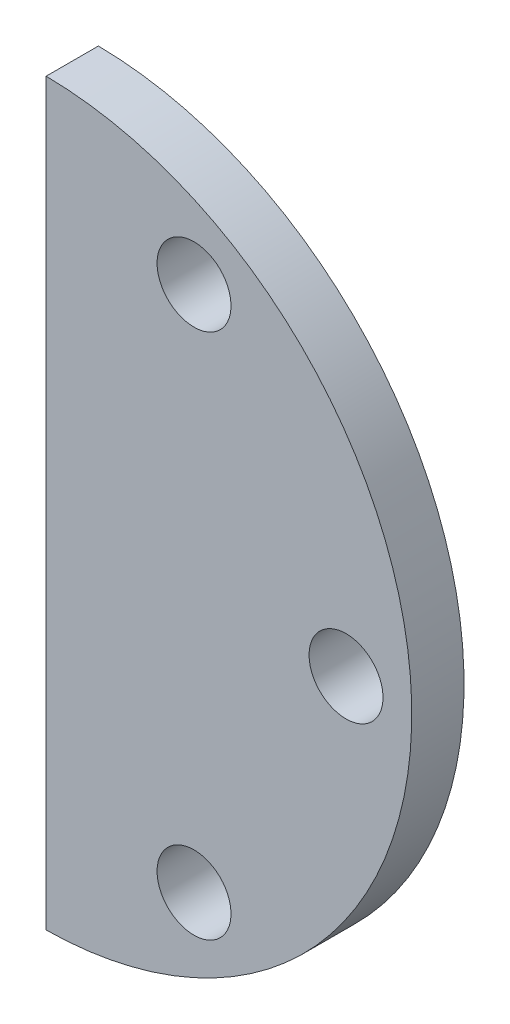
ISO-10303-21;
HEADER;
FILE_DESCRIPTION(('STEP AP214'),'2;1');
FILE_NAME('part.step','',(''),(''),'','','');
FILE_SCHEMA(('AUTOMOTIVE_DESIGN { 1 0 10303 214 1 1 1 1 }'));
ENDSEC;
DATA;
#1=APPLICATION_CONTEXT('core data for automotive mechanical design processes');
#2=APPLICATION_PROTOCOL_DEFINITION('international standard','automotive_design',2000,#1);
#3=PRODUCT_CONTEXT('',#1,'mechanical');
#4=PRODUCT('Part','Part','',(#3));
#5=PRODUCT_RELATED_PRODUCT_CATEGORY('part','',(#4));
#6=PRODUCT_DEFINITION_FORMATION('','',#4);
#7=PRODUCT_DEFINITION_CONTEXT('part definition',#1,'design');
#8=PRODUCT_DEFINITION('design','',#6,#7);
#9=PRODUCT_DEFINITION_SHAPE('','',#8);
#10=(LENGTH_UNIT() NAMED_UNIT(*) SI_UNIT(.MILLI.,.METRE.));
#11=(NAMED_UNIT(*) PLANE_ANGLE_UNIT() SI_UNIT($,.RADIAN.));
#12=(NAMED_UNIT(*) SI_UNIT($,.STERADIAN.) SOLID_ANGLE_UNIT());
#13=UNCERTAINTY_MEASURE_WITH_UNIT(LENGTH_MEASURE(1.E-05),#10,'distance_accuracy_value','');
#14=(GEOMETRIC_REPRESENTATION_CONTEXT(3) GLOBAL_UNCERTAINTY_ASSIGNED_CONTEXT((#13)) GLOBAL_UNIT_ASSIGNED_CONTEXT((#10,
#11,#12)) REPRESENTATION_CONTEXT('',''));
#15=CARTESIAN_POINT('',(0.,0.,0.));
#16=DIRECTION('',(0.,0.,1.));
#17=DIRECTION('',(1.,0.,0.));
#18=AXIS2_PLACEMENT_3D('',#15,#16,#17);
#19=CARTESIAN_POINT('',(0.,0.,3.18));
#20=DIRECTION('',(0.,0.,-1.));
#21=DIRECTION('',(-1.,0.,0.));
#22=AXIS2_PLACEMENT_3D('',#19,#20,#21);
#23=CYLINDRICAL_SURFACE('',#22,22.5);
#24=CARTESIAN_POINT('',(0.,0.,0.));
#25=DIRECTION('',(0.,0.,1.));
#26=DIRECTION('',(1.,0.,0.));
#27=AXIS2_PLACEMENT_3D('',#24,#25,#26);
#28=CIRCLE('',#27,22.5);
#29=CARTESIAN_POINT('',(0.250000000000006,-22.4986110682415,0.));
#30=VERTEX_POINT('',#29);
#31=CARTESIAN_POINT('',(0.250000000000008,22.4986110682415,0.));
#32=VERTEX_POINT('',#31);
#33=EDGE_CURVE('E77',#30,#32,#28,.T.);
#34=ORIENTED_EDGE('',*,*,#33,.T.);
#35=DIRECTION('',(0.,0.,-1.));
#36=VECTOR('',#35,1.);
#37=CARTESIAN_POINT('',(0.250000000000008,22.4986110682415,3.18));
#38=LINE('',#37,#36);
#39=CARTESIAN_POINT('',(0.250000000000008,22.4986110682415,3.18));
#40=VERTEX_POINT('',#39);
#41=EDGE_CURVE('E11',#40,#32,#38,.T.);
#42=ORIENTED_EDGE('',*,*,#41,.F.);
#43=CARTESIAN_POINT('',(0.,0.,3.18));
#44=DIRECTION('',(0.,0.,1.));
#45=DIRECTION('',(1.,0.,0.));
#46=AXIS2_PLACEMENT_3D('',#43,#44,#45);
#47=CIRCLE('',#46,22.5);
#48=CARTESIAN_POINT('',(0.250000000000006,-22.4986110682415,3.18));
#49=VERTEX_POINT('',#48);
#50=EDGE_CURVE('E80',#49,#40,#47,.T.);
#51=ORIENTED_EDGE('',*,*,#50,.F.);
#52=DIRECTION('',(0.,0.,-1.));
#53=VECTOR('',#52,1.);
#54=CARTESIAN_POINT('',(0.250000000000006,-22.4986110682415,3.18));
#55=LINE('',#54,#53);
#56=EDGE_CURVE('E53',#49,#30,#55,.T.);
#57=ORIENTED_EDGE('',*,*,#56,.T.);
#58=EDGE_LOOP('',(#34,#42,#51,#57));
#59=FACE_BOUND('',#58,.T.);
#60=ADVANCED_FACE('F43',(#59),#23,.T.);
#61=CARTESIAN_POINT('',(9.25000000000191,-16.0214699700121,3.18));
#62=DIRECTION('',(0.,0.,-1.));
#63=DIRECTION('',(-1.,0.,0.));
#64=AXIS2_PLACEMENT_3D('',#61,#62,#63);
#65=CYLINDRICAL_SURFACE('',#64,2.25000000000046);
#66=CARTESIAN_POINT('',(9.25000000000191,-16.0214699700121,3.18));
#67=DIRECTION('',(0.,0.,1.));
#68=DIRECTION('',(1.,0.,0.));
#69=AXIS2_PLACEMENT_3D('',#66,#67,#68);
#70=CIRCLE('',#69,2.25000000000046);
#71=CARTESIAN_POINT('',(7.00000000000144,-16.0214699700121,3.18));
#72=VERTEX_POINT('',#71);
#73=EDGE_CURVE('E102',#72,#72,#70,.T.);
#74=CARTESIAN_POINT('',(9.25000000000191,-16.0214699700121,0.));
#75=DIRECTION('',(0.,0.,1.));
#76=DIRECTION('',(1.,0.,0.));
#77=AXIS2_PLACEMENT_3D('',#74,#75,#76);
#78=CIRCLE('',#77,2.25000000000046);
#79=CARTESIAN_POINT('',(7.00000000000144,-16.0214699700121,0.));
#80=VERTEX_POINT('',#79);
#81=EDGE_CURVE('E84',#80,#80,#78,.T.);
#82=CARTESIAN_POINT('',(7.00000000000144,-16.0214699700121,3.18));
#83=CARTESIAN_POINT('',(7.00000000000144,-16.0214699700121,3.146875));
#84=CARTESIAN_POINT('',(7.00000000000144,-16.0214699700121,3.11375));
#85=CARTESIAN_POINT('',(7.00000000000144,-16.0214699700121,3.0475));
#86=CARTESIAN_POINT('',(7.00000000000144,-16.0214699700121,3.014375));
#87=CARTESIAN_POINT('',(7.00000000000144,-16.0214699700121,2.948125));
#88=CARTESIAN_POINT('',(7.00000000000144,-16.0214699700121,2.915));
#89=CARTESIAN_POINT('',(7.00000000000144,-16.0214699700121,2.84875));
#90=CARTESIAN_POINT('',(7.00000000000144,-16.0214699700121,2.815625));
#91=CARTESIAN_POINT('',(7.00000000000144,-16.0214699700121,2.749375));
#92=CARTESIAN_POINT('',(7.00000000000144,-16.0214699700121,2.71625));
#93=CARTESIAN_POINT('',(7.00000000000144,-16.0214699700121,2.65));
#94=CARTESIAN_POINT('',(7.00000000000144,-16.0214699700121,2.616875));
#95=CARTESIAN_POINT('',(7.00000000000144,-16.0214699700121,2.550625));
#96=CARTESIAN_POINT('',(7.00000000000144,-16.0214699700121,2.5175));
#97=CARTESIAN_POINT('',(7.00000000000144,-16.0214699700121,2.45125));
#98=CARTESIAN_POINT('',(7.00000000000144,-16.0214699700121,2.418125));
#99=CARTESIAN_POINT('',(7.00000000000144,-16.0214699700121,2.351875));
#100=CARTESIAN_POINT('',(7.00000000000144,-16.0214699700121,2.31875));
#101=CARTESIAN_POINT('',(7.00000000000144,-16.0214699700121,2.2525));
#102=CARTESIAN_POINT('',(7.00000000000144,-16.0214699700121,2.219375));
#103=CARTESIAN_POINT('',(7.00000000000144,-16.0214699700121,2.153125));
#104=CARTESIAN_POINT('',(7.00000000000144,-16.0214699700121,2.12));
#105=CARTESIAN_POINT('',(7.00000000000144,-16.0214699700121,2.05375));
#106=CARTESIAN_POINT('',(7.00000000000144,-16.0214699700121,2.020625));
#107=CARTESIAN_POINT('',(7.00000000000144,-16.0214699700121,1.954375));
#108=CARTESIAN_POINT('',(7.00000000000144,-16.0214699700121,1.92125));
#109=CARTESIAN_POINT('',(7.00000000000144,-16.0214699700121,1.855));
#110=CARTESIAN_POINT('',(7.00000000000144,-16.0214699700121,1.821875));
#111=CARTESIAN_POINT('',(7.00000000000144,-16.0214699700121,1.755625));
#112=CARTESIAN_POINT('',(7.00000000000144,-16.0214699700121,1.7225));
#113=CARTESIAN_POINT('',(7.00000000000144,-16.0214699700121,1.65625));
#114=CARTESIAN_POINT('',(7.00000000000144,-16.0214699700121,1.623125));
#115=CARTESIAN_POINT('',(7.00000000000144,-16.0214699700121,1.556875));
#116=CARTESIAN_POINT('',(7.00000000000144,-16.0214699700121,1.52375));
#117=CARTESIAN_POINT('',(7.00000000000144,-16.0214699700121,1.4575));
#118=CARTESIAN_POINT('',(7.00000000000144,-16.0214699700121,1.424375));
#119=CARTESIAN_POINT('',(7.00000000000144,-16.0214699700121,1.358125));
#120=CARTESIAN_POINT('',(7.00000000000144,-16.0214699700121,1.325));
#121=CARTESIAN_POINT('',(7.00000000000144,-16.0214699700121,1.25875));
#122=CARTESIAN_POINT('',(7.00000000000144,-16.0214699700121,1.225625));
#123=CARTESIAN_POINT('',(7.00000000000144,-16.0214699700121,1.159375));
#124=CARTESIAN_POINT('',(7.00000000000144,-16.0214699700121,1.12625));
#125=CARTESIAN_POINT('',(7.00000000000144,-16.0214699700121,1.06));
#126=CARTESIAN_POINT('',(7.00000000000144,-16.0214699700121,1.026875));
#127=CARTESIAN_POINT('',(7.00000000000144,-16.0214699700121,0.960625));
#128=CARTESIAN_POINT('',(7.00000000000144,-16.0214699700121,0.9275));
#129=CARTESIAN_POINT('',(7.00000000000144,-16.0214699700121,0.86125));
#130=CARTESIAN_POINT('',(7.00000000000144,-16.0214699700121,0.828125));
#131=CARTESIAN_POINT('',(7.00000000000144,-16.0214699700121,0.761875));
#132=CARTESIAN_POINT('',(7.00000000000144,-16.0214699700121,0.72875));
#133=CARTESIAN_POINT('',(7.00000000000144,-16.0214699700121,0.6625));
#134=CARTESIAN_POINT('',(7.00000000000144,-16.0214699700121,0.629375));
#135=CARTESIAN_POINT('',(7.00000000000144,-16.0214699700121,0.563125));
#136=CARTESIAN_POINT('',(7.00000000000144,-16.0214699700121,0.53));
#137=CARTESIAN_POINT('',(7.00000000000144,-16.0214699700121,0.46375));
#138=CARTESIAN_POINT('',(7.00000000000144,-16.0214699700121,0.430625));
#139=CARTESIAN_POINT('',(7.00000000000144,-16.0214699700121,0.364375));
#140=CARTESIAN_POINT('',(7.00000000000144,-16.0214699700121,0.33125));
#141=CARTESIAN_POINT('',(7.00000000000144,-16.0214699700121,0.265));
#142=CARTESIAN_POINT('',(7.00000000000144,-16.0214699700121,0.231875));
#143=CARTESIAN_POINT('',(7.00000000000144,-16.0214699700121,0.165625));
#144=CARTESIAN_POINT('',(7.00000000000144,-16.0214699700121,0.1325));
#145=CARTESIAN_POINT('',(7.00000000000144,-16.0214699700121,0.06625));
#146=CARTESIAN_POINT('',(7.00000000000144,-16.0214699700121,0.033125));
#147=CARTESIAN_POINT('',(7.00000000000144,-16.0214699700121,0.));
#148=B_SPLINE_CURVE_WITH_KNOTS('',3,(#82,#83,#84,#85,#86,#87,#88,#89,#90,#91,#92,#93,#94,#95,
#96,#97,#98,#99,#100,#101,#102,#103,#104,#105,#106,#107,#108,#109,#110,#111,#112,#113,#114,#115,
#116,#117,#118,#119,#120,#121,#122,#123,#124,#125,#126,#127,#128,#129,#130,#131,#132,#133,#134,
#135,#136,#137,#138,#139,#140,#141,#142,#143,#144,#145,#146,#147),.UNSPECIFIED.,.F.,.F.,(4,2,2,
2,2,2,2,2,2,2,2,2,2,2,2,2,2,2,2,2,2,2,2,2,2,2,2,2,2,2,2,2,4),(0.,0.0993750000000001,0.19875,
0.298125,0.3975,0.496875,0.59625,0.695625,0.795,0.894375,0.99375,1.093125,1.1925,1.291875,
1.39125,1.490625,1.59,1.689375,1.78875,1.888125,1.9875,2.086875,2.18625,2.285625,2.385,2.484375,
2.58375,2.683125,2.7825,2.881875,2.98125,3.080625,3.18),.UNSPECIFIED.);
#149=EDGE_CURVE('BSEAM124',#72,#80,#148,.T.);
#150=ORIENTED_EDGE('',*,*,#73,.T.);
#151=ORIENTED_EDGE('',*,*,#81,.F.);
#152=ORIENTED_EDGE('',*,*,#149,.T.);
#153=ORIENTED_EDGE('',*,*,#149,.F.);
#154=EDGE_LOOP('',(#150,#152,#151,#153));
#155=FACE_BOUND('',#154,.T.);
#156=ADVANCED_FACE('F124',(#155),#65,.F.);
#157=CARTESIAN_POINT('',(18.5000000000009,6.39585606698739E-13,3.18));
#158=DIRECTION('',(0.,0.,-1.));
#159=DIRECTION('',(-1.,0.,0.));
#160=AXIS2_PLACEMENT_3D('',#157,#158,#159);
#161=CYLINDRICAL_SURFACE('',#160,2.24999999999973);
#162=CARTESIAN_POINT('',(18.5000000000009,6.39585606698739E-13,3.18));
#163=DIRECTION('',(0.,0.,1.));
#164=DIRECTION('',(1.,0.,0.));
#165=AXIS2_PLACEMENT_3D('',#162,#163,#164);
#166=CIRCLE('',#165,2.24999999999973);
#167=CARTESIAN_POINT('',(16.2500000000012,6.39585606698739E-13,3.18));
#168=VERTEX_POINT('',#167);
#169=EDGE_CURVE('E106',#168,#168,#166,.T.);
#170=CARTESIAN_POINT('',(18.5000000000009,6.39585606698739E-13,0.));
#171=DIRECTION('',(0.,0.,1.));
#172=DIRECTION('',(1.,0.,0.));
#173=AXIS2_PLACEMENT_3D('',#170,#171,#172);
#174=CIRCLE('',#173,2.24999999999973);
#175=CARTESIAN_POINT('',(16.2500000000012,6.39585606698739E-13,0.));
#176=VERTEX_POINT('',#175);
#177=EDGE_CURVE('E88',#176,#176,#174,.T.);
#178=CARTESIAN_POINT('',(16.2500000000012,6.39585606698739E-13,3.18));
#179=CARTESIAN_POINT('',(16.2500000000012,6.39585606698739E-13,3.146875));
#180=CARTESIAN_POINT('',(16.2500000000012,6.39585606698739E-13,3.11375));
#181=CARTESIAN_POINT('',(16.2500000000012,6.39585606698739E-13,3.0475));
#182=CARTESIAN_POINT('',(16.2500000000012,6.39585606698739E-13,3.014375));
#183=CARTESIAN_POINT('',(16.2500000000012,6.39585606698739E-13,2.948125));
#184=CARTESIAN_POINT('',(16.2500000000012,6.39585606698739E-13,2.915));
#185=CARTESIAN_POINT('',(16.2500000000012,6.39585606698739E-13,2.84875));
#186=CARTESIAN_POINT('',(16.2500000000012,6.39585606698739E-13,2.815625));
#187=CARTESIAN_POINT('',(16.2500000000012,6.39585606698739E-13,2.749375));
#188=CARTESIAN_POINT('',(16.2500000000012,6.39585606698739E-13,2.71625));
#189=CARTESIAN_POINT('',(16.2500000000012,6.39585606698739E-13,2.65));
#190=CARTESIAN_POINT('',(16.2500000000012,6.39585606698739E-13,2.616875));
#191=CARTESIAN_POINT('',(16.2500000000012,6.39585606698739E-13,2.550625));
#192=CARTESIAN_POINT('',(16.2500000000012,6.39585606698739E-13,2.5175));
#193=CARTESIAN_POINT('',(16.2500000000012,6.39585606698739E-13,2.45125));
#194=CARTESIAN_POINT('',(16.2500000000012,6.39585606698739E-13,2.418125));
#195=CARTESIAN_POINT('',(16.2500000000012,6.39585606698739E-13,2.351875));
#196=CARTESIAN_POINT('',(16.2500000000012,6.39585606698739E-13,2.31875));
#197=CARTESIAN_POINT('',(16.2500000000012,6.39585606698739E-13,2.2525));
#198=CARTESIAN_POINT('',(16.2500000000012,6.39585606698739E-13,2.219375));
#199=CARTESIAN_POINT('',(16.2500000000012,6.39585606698739E-13,2.153125));
#200=CARTESIAN_POINT('',(16.2500000000012,6.39585606698739E-13,2.12));
#201=CARTESIAN_POINT('',(16.2500000000012,6.39585606698739E-13,2.05375));
#202=CARTESIAN_POINT('',(16.2500000000012,6.39585606698739E-13,2.020625));
#203=CARTESIAN_POINT('',(16.2500000000012,6.39585606698739E-13,1.954375));
#204=CARTESIAN_POINT('',(16.2500000000012,6.39585606698739E-13,1.92125));
#205=CARTESIAN_POINT('',(16.2500000000012,6.39585606698739E-13,1.855));
#206=CARTESIAN_POINT('',(16.2500000000012,6.39585606698739E-13,1.821875));
#207=CARTESIAN_POINT('',(16.2500000000012,6.39585606698739E-13,1.755625));
#208=CARTESIAN_POINT('',(16.2500000000012,6.39585606698739E-13,1.7225));
#209=CARTESIAN_POINT('',(16.2500000000012,6.39585606698739E-13,1.65625));
#210=CARTESIAN_POINT('',(16.2500000000012,6.39585606698739E-13,1.623125));
#211=CARTESIAN_POINT('',(16.2500000000012,6.39585606698739E-13,1.556875));
#212=CARTESIAN_POINT('',(16.2500000000012,6.39585606698739E-13,1.52375));
#213=CARTESIAN_POINT('',(16.2500000000012,6.39585606698739E-13,1.4575));
#214=CARTESIAN_POINT('',(16.2500000000012,6.39585606698739E-13,1.424375));
#215=CARTESIAN_POINT('',(16.2500000000012,6.39585606698739E-13,1.358125));
#216=CARTESIAN_POINT('',(16.2500000000012,6.39585606698739E-13,1.325));
#217=CARTESIAN_POINT('',(16.2500000000012,6.39585606698739E-13,1.25875));
#218=CARTESIAN_POINT('',(16.2500000000012,6.39585606698739E-13,1.225625));
#219=CARTESIAN_POINT('',(16.2500000000012,6.39585606698739E-13,1.159375));
#220=CARTESIAN_POINT('',(16.2500000000012,6.39585606698739E-13,1.12625));
#221=CARTESIAN_POINT('',(16.2500000000012,6.39585606698739E-13,1.06));
#222=CARTESIAN_POINT('',(16.2500000000012,6.39585606698739E-13,1.026875));
#223=CARTESIAN_POINT('',(16.2500000000012,6.39585606698739E-13,0.960625));
#224=CARTESIAN_POINT('',(16.2500000000012,6.39585606698739E-13,0.9275));
#225=CARTESIAN_POINT('',(16.2500000000012,6.39585606698739E-13,0.86125));
#226=CARTESIAN_POINT('',(16.2500000000012,6.39585606698739E-13,0.828125));
#227=CARTESIAN_POINT('',(16.2500000000012,6.39585606698739E-13,0.761875));
#228=CARTESIAN_POINT('',(16.2500000000012,6.39585606698739E-13,0.72875));
#229=CARTESIAN_POINT('',(16.2500000000012,6.39585606698739E-13,0.6625));
#230=CARTESIAN_POINT('',(16.2500000000012,6.39585606698739E-13,0.629375));
#231=CARTESIAN_POINT('',(16.2500000000012,6.39585606698739E-13,0.563125));
#232=CARTESIAN_POINT('',(16.2500000000012,6.39585606698739E-13,0.53));
#233=CARTESIAN_POINT('',(16.2500000000012,6.39585606698739E-13,0.46375));
#234=CARTESIAN_POINT('',(16.2500000000012,6.39585606698739E-13,0.430625));
#235=CARTESIAN_POINT('',(16.2500000000012,6.39585606698739E-13,0.364375));
#236=CARTESIAN_POINT('',(16.2500000000012,6.39585606698739E-13,0.33125));
#237=CARTESIAN_POINT('',(16.2500000000012,6.39585606698739E-13,0.265));
#238=CARTESIAN_POINT('',(16.2500000000012,6.39585606698739E-13,0.231875));
#239=CARTESIAN_POINT('',(16.2500000000012,6.39585606698739E-13,0.165625));
#240=CARTESIAN_POINT('',(16.2500000000012,6.39585606698739E-13,0.1325));
#241=CARTESIAN_POINT('',(16.2500000000012,6.39585606698739E-13,0.06625));
#242=CARTESIAN_POINT('',(16.2500000000012,6.39585606698739E-13,0.033125));
#243=CARTESIAN_POINT('',(16.2500000000012,6.39585606698739E-13,0.));
#244=B_SPLINE_CURVE_WITH_KNOTS('',3,(#178,#179,#180,#181,#182,#183,#184,#185,#186,#187,#188,
#189,#190,#191,#192,#193,#194,#195,#196,#197,#198,#199,#200,#201,#202,#203,#204,#205,#206,#207,
#208,#209,#210,#211,#212,#213,#214,#215,#216,#217,#218,#219,#220,#221,#222,#223,#224,#225,#226,
#227,#228,#229,#230,#231,#232,#233,#234,#235,#236,#237,#238,#239,#240,#241,#242,#243),
.UNSPECIFIED.,.F.,.F.,(4,2,2,2,2,2,2,2,2,2,2,2,2,2,2,2,2,2,2,2,2,2,2,2,2,2,2,2,2,2,2,2,4),(0.,
0.0993750000000001,0.19875,0.298125,0.3975,0.496875,0.59625,0.695625,0.795,0.894375,0.99375,
1.093125,1.1925,1.291875,1.39125,1.490625,1.59,1.689375,1.78875,1.888125,1.9875,2.086875,
2.18625,2.285625,2.385,2.484375,2.58375,2.683125,2.7825,2.881875,2.98125,3.080625,3.18),.UNSPECIFIED.);
#245=EDGE_CURVE('BSEAM127',#168,#176,#244,.T.);
#246=ORIENTED_EDGE('',*,*,#169,.T.);
#247=ORIENTED_EDGE('',*,*,#177,.F.);
#248=ORIENTED_EDGE('',*,*,#245,.T.);
#249=ORIENTED_EDGE('',*,*,#245,.F.);
#250=EDGE_LOOP('',(#246,#248,#247,#249));
#251=FACE_BOUND('',#250,.T.);
#252=ADVANCED_FACE('F127',(#251),#161,.F.);
#253=CARTESIAN_POINT('',(9.2499999999999,16.0214699700122,3.18));
#254=DIRECTION('',(0.,0.,-1.));
#255=DIRECTION('',(-1.,0.,0.));
#256=AXIS2_PLACEMENT_3D('',#253,#254,#255);
#257=CYLINDRICAL_SURFACE('',#256,2.25);
#258=CARTESIAN_POINT('',(9.2499999999999,16.0214699700122,3.18));
#259=DIRECTION('',(0.,0.,1.));
#260=DIRECTION('',(1.,0.,0.));
#261=AXIS2_PLACEMENT_3D('',#258,#259,#260);
#262=CIRCLE('',#261,2.25);
#263=CARTESIAN_POINT('',(6.9999999999999,16.0214699700122,3.18));
#264=VERTEX_POINT('',#263);
#265=EDGE_CURVE('E76',#264,#264,#262,.T.);
#266=CARTESIAN_POINT('',(9.2499999999999,16.0214699700122,0.));
#267=DIRECTION('',(0.,0.,1.));
#268=DIRECTION('',(1.,0.,0.));
#269=AXIS2_PLACEMENT_3D('',#266,#267,#268);
#270=CIRCLE('',#269,2.25);
#271=CARTESIAN_POINT('',(6.9999999999999,16.0214699700122,0.));
#272=VERTEX_POINT('',#271);
#273=EDGE_CURVE('E94',#272,#272,#270,.T.);
#274=CARTESIAN_POINT('',(6.9999999999999,16.0214699700122,3.18));
#275=CARTESIAN_POINT('',(6.9999999999999,16.0214699700122,3.146875));
#276=CARTESIAN_POINT('',(6.9999999999999,16.0214699700122,3.11375));
#277=CARTESIAN_POINT('',(6.9999999999999,16.0214699700122,3.0475));
#278=CARTESIAN_POINT('',(6.9999999999999,16.0214699700122,3.014375));
#279=CARTESIAN_POINT('',(6.9999999999999,16.0214699700122,2.948125));
#280=CARTESIAN_POINT('',(6.9999999999999,16.0214699700122,2.915));
#281=CARTESIAN_POINT('',(6.9999999999999,16.0214699700122,2.84875));
#282=CARTESIAN_POINT('',(6.9999999999999,16.0214699700122,2.815625));
#283=CARTESIAN_POINT('',(6.9999999999999,16.0214699700122,2.749375));
#284=CARTESIAN_POINT('',(6.9999999999999,16.0214699700122,2.71625));
#285=CARTESIAN_POINT('',(6.9999999999999,16.0214699700122,2.65));
#286=CARTESIAN_POINT('',(6.9999999999999,16.0214699700122,2.616875));
#287=CARTESIAN_POINT('',(6.9999999999999,16.0214699700122,2.550625));
#288=CARTESIAN_POINT('',(6.9999999999999,16.0214699700122,2.5175));
#289=CARTESIAN_POINT('',(6.9999999999999,16.0214699700122,2.45125));
#290=CARTESIAN_POINT('',(6.9999999999999,16.0214699700122,2.418125));
#291=CARTESIAN_POINT('',(6.9999999999999,16.0214699700122,2.351875));
#292=CARTESIAN_POINT('',(6.9999999999999,16.0214699700122,2.31875));
#293=CARTESIAN_POINT('',(6.9999999999999,16.0214699700122,2.2525));
#294=CARTESIAN_POINT('',(6.9999999999999,16.0214699700122,2.219375));
#295=CARTESIAN_POINT('',(6.9999999999999,16.0214699700122,2.153125));
#296=CARTESIAN_POINT('',(6.9999999999999,16.0214699700122,2.12));
#297=CARTESIAN_POINT('',(6.9999999999999,16.0214699700122,2.05375));
#298=CARTESIAN_POINT('',(6.9999999999999,16.0214699700122,2.020625));
#299=CARTESIAN_POINT('',(6.9999999999999,16.0214699700122,1.954375));
#300=CARTESIAN_POINT('',(6.9999999999999,16.0214699700122,1.92125));
#301=CARTESIAN_POINT('',(6.9999999999999,16.0214699700122,1.855));
#302=CARTESIAN_POINT('',(6.9999999999999,16.0214699700122,1.821875));
#303=CARTESIAN_POINT('',(6.9999999999999,16.0214699700122,1.755625));
#304=CARTESIAN_POINT('',(6.9999999999999,16.0214699700122,1.7225));
#305=CARTESIAN_POINT('',(6.9999999999999,16.0214699700122,1.65625));
#306=CARTESIAN_POINT('',(6.9999999999999,16.0214699700122,1.623125));
#307=CARTESIAN_POINT('',(6.9999999999999,16.0214699700122,1.556875));
#308=CARTESIAN_POINT('',(6.9999999999999,16.0214699700122,1.52375));
#309=CARTESIAN_POINT('',(6.9999999999999,16.0214699700122,1.4575));
#310=CARTESIAN_POINT('',(6.9999999999999,16.0214699700122,1.424375));
#311=CARTESIAN_POINT('',(6.9999999999999,16.0214699700122,1.358125));
#312=CARTESIAN_POINT('',(6.9999999999999,16.0214699700122,1.325));
#313=CARTESIAN_POINT('',(6.9999999999999,16.0214699700122,1.25875));
#314=CARTESIAN_POINT('',(6.9999999999999,16.0214699700122,1.225625));
#315=CARTESIAN_POINT('',(6.9999999999999,16.0214699700122,1.159375));
#316=CARTESIAN_POINT('',(6.9999999999999,16.0214699700122,1.12625));
#317=CARTESIAN_POINT('',(6.9999999999999,16.0214699700122,1.06));
#318=CARTESIAN_POINT('',(6.9999999999999,16.0214699700122,1.026875));
#319=CARTESIAN_POINT('',(6.9999999999999,16.0214699700122,0.960625));
#320=CARTESIAN_POINT('',(6.9999999999999,16.0214699700122,0.9275));
#321=CARTESIAN_POINT('',(6.9999999999999,16.0214699700122,0.86125));
#322=CARTESIAN_POINT('',(6.9999999999999,16.0214699700122,0.828125));
#323=CARTESIAN_POINT('',(6.9999999999999,16.0214699700122,0.761875));
#324=CARTESIAN_POINT('',(6.9999999999999,16.0214699700122,0.72875));
#325=CARTESIAN_POINT('',(6.9999999999999,16.0214699700122,0.6625));
#326=CARTESIAN_POINT('',(6.9999999999999,16.0214699700122,0.629375));
#327=CARTESIAN_POINT('',(6.9999999999999,16.0214699700122,0.563125));
#328=CARTESIAN_POINT('',(6.9999999999999,16.0214699700122,0.53));
#329=CARTESIAN_POINT('',(6.9999999999999,16.0214699700122,0.46375));
#330=CARTESIAN_POINT('',(6.9999999999999,16.0214699700122,0.430625));
#331=CARTESIAN_POINT('',(6.9999999999999,16.0214699700122,0.364375));
#332=CARTESIAN_POINT('',(6.9999999999999,16.0214699700122,0.33125));
#333=CARTESIAN_POINT('',(6.9999999999999,16.0214699700122,0.265));
#334=CARTESIAN_POINT('',(6.9999999999999,16.0214699700122,0.231875));
#335=CARTESIAN_POINT('',(6.9999999999999,16.0214699700122,0.165625));
#336=CARTESIAN_POINT('',(6.9999999999999,16.0214699700122,0.1325));
#337=CARTESIAN_POINT('',(6.9999999999999,16.0214699700122,0.06625));
#338=CARTESIAN_POINT('',(6.9999999999999,16.0214699700122,0.033125));
#339=CARTESIAN_POINT('',(6.9999999999999,16.0214699700122,0.));
#340=B_SPLINE_CURVE_WITH_KNOTS('',3,(#274,#275,#276,#277,#278,#279,#280,#281,#282,#283,#284,
#285,#286,#287,#288,#289,#290,#291,#292,#293,#294,#295,#296,#297,#298,#299,#300,#301,#302,#303,
#304,#305,#306,#307,#308,#309,#310,#311,#312,#313,#314,#315,#316,#317,#318,#319,#320,#321,#322,
#323,#324,#325,#326,#327,#328,#329,#330,#331,#332,#333,#334,#335,#336,#337,#338,#339),
.UNSPECIFIED.,.F.,.F.,(4,2,2,2,2,2,2,2,2,2,2,2,2,2,2,2,2,2,2,2,2,2,2,2,2,2,2,2,2,2,2,2,4),(0.,
0.0993750000000001,0.19875,0.298125,0.3975,0.496875,0.59625,0.695625,0.795,0.894375,0.99375,
1.093125,1.1925,1.291875,1.39125,1.490625,1.59,1.689375,1.78875,1.888125,1.9875,2.086875,
2.18625,2.285625,2.385,2.484375,2.58375,2.683125,2.7825,2.881875,2.98125,3.080625,3.18),.UNSPECIFIED.);
#341=EDGE_CURVE('BSEAM45',#264,#272,#340,.T.);
#342=ORIENTED_EDGE('',*,*,#265,.T.);
#343=ORIENTED_EDGE('',*,*,#273,.F.);
#344=ORIENTED_EDGE('',*,*,#341,.T.);
#345=ORIENTED_EDGE('',*,*,#341,.F.);
#346=EDGE_LOOP('',(#342,#344,#343,#345));
#347=FACE_BOUND('',#346,.T.);
#348=ADVANCED_FACE('F45',(#347),#257,.F.);
#349=CARTESIAN_POINT('',(0.250000000000007,0.,3.18));
#350=DIRECTION('',(1.,0.,0.));
#351=DIRECTION('',(0.,1.,0.));
#352=AXIS2_PLACEMENT_3D('',#349,#350,#351);
#353=PLANE('',#352);
#354=DIRECTION('',(0.,-1.,0.));
#355=VECTOR('',#354,1.);
#356=CARTESIAN_POINT('',(0.250000000000007,0.,0.));
#357=LINE('',#356,#355);
#358=EDGE_CURVE('E68',#32,#30,#357,.T.);
#359=ORIENTED_EDGE('',*,*,#358,.T.);
#360=ORIENTED_EDGE('',*,*,#56,.F.);
#361=DIRECTION('',(0.,-1.,0.));
#362=VECTOR('',#361,1.);
#363=CARTESIAN_POINT('',(0.250000000000007,0.,3.18));
#364=LINE('',#363,#362);
#365=EDGE_CURVE('E60',#40,#49,#364,.T.);
#366=ORIENTED_EDGE('',*,*,#365,.F.);
#367=ORIENTED_EDGE('',*,*,#41,.T.);
#368=EDGE_LOOP('',(#359,#360,#366,#367));
#369=FACE_BOUND('',#368,.T.);
#370=ADVANCED_FACE('F71',(#369),#353,.F.);
#371=CARTESIAN_POINT('',(0.,0.,3.18));
#372=DIRECTION('',(0.,0.,1.));
#373=DIRECTION('',(1.,0.,0.));
#374=AXIS2_PLACEMENT_3D('',#371,#372,#373);
#375=PLANE('',#374);
#376=ORIENTED_EDGE('',*,*,#265,.F.);
#377=EDGE_LOOP('',(#376));
#378=FACE_BOUND('',#377,.T.);
#379=ORIENTED_EDGE('',*,*,#169,.F.);
#380=EDGE_LOOP('',(#379));
#381=FACE_BOUND('',#380,.T.);
#382=ORIENTED_EDGE('',*,*,#73,.F.);
#383=EDGE_LOOP('',(#382));
#384=FACE_BOUND('',#383,.T.);
#385=ORIENTED_EDGE('',*,*,#50,.T.);
#386=ORIENTED_EDGE('',*,*,#365,.T.);
#387=EDGE_LOOP('',(#385,#386));
#388=FACE_BOUND('',#387,.T.);
#389=ADVANCED_FACE('F116',(#378,#381,#384,#388),#375,.T.);
#390=CARTESIAN_POINT('',(0.,0.,0.));
#391=DIRECTION('',(0.,0.,1.));
#392=DIRECTION('',(1.,0.,0.));
#393=AXIS2_PLACEMENT_3D('',#390,#391,#392);
#394=PLANE('',#393);
#395=ORIENTED_EDGE('',*,*,#273,.T.);
#396=EDGE_LOOP('',(#395));
#397=FACE_BOUND('',#396,.T.);
#398=ORIENTED_EDGE('',*,*,#177,.T.);
#399=EDGE_LOOP('',(#398));
#400=FACE_BOUND('',#399,.T.);
#401=ORIENTED_EDGE('',*,*,#81,.T.);
#402=EDGE_LOOP('',(#401));
#403=FACE_BOUND('',#402,.T.);
#404=ORIENTED_EDGE('',*,*,#33,.F.);
#405=ORIENTED_EDGE('',*,*,#358,.F.);
#406=EDGE_LOOP('',(#404,#405));
#407=FACE_BOUND('',#406,.T.);
#408=ADVANCED_FACE('F82',(#397,#400,#403,#407),#394,.F.);
#409=CLOSED_SHELL('',(#60,#156,#252,#348,#370,#389,#408));
#410=MANIFOLD_SOLID_BREP('B2',#409);
#411=ADVANCED_BREP_SHAPE_REPRESENTATION('',(#18,#410),#14);
#412=SHAPE_DEFINITION_REPRESENTATION(#9,#411);
ENDSEC;
END-ISO-10303-21;
